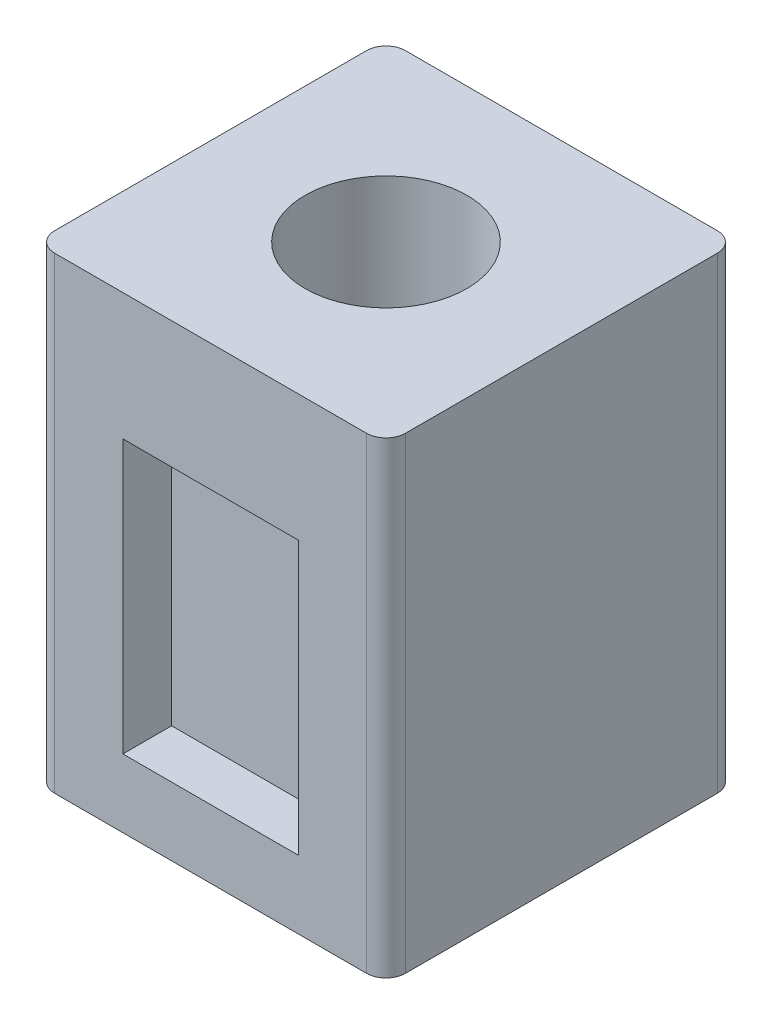
ISO-10303-21;
HEADER;
FILE_DESCRIPTION(('STEP AP214'),'2;1');
FILE_NAME('part.step','',(''),(''),'','','');
FILE_SCHEMA(('AUTOMOTIVE_DESIGN { 1 0 10303 214 1 1 1 1 }'));
ENDSEC;
DATA;
#1=APPLICATION_CONTEXT('core data for automotive mechanical design processes');
#2=APPLICATION_PROTOCOL_DEFINITION('international standard','automotive_design',2000,#1);
#3=PRODUCT_CONTEXT('',#1,'mechanical');
#4=PRODUCT('Part','Part','',(#3));
#5=PRODUCT_RELATED_PRODUCT_CATEGORY('part','',(#4));
#6=PRODUCT_DEFINITION_FORMATION('','',#4);
#7=PRODUCT_DEFINITION_CONTEXT('part definition',#1,'design');
#8=PRODUCT_DEFINITION('design','',#6,#7);
#9=PRODUCT_DEFINITION_SHAPE('','',#8);
#10=(LENGTH_UNIT() NAMED_UNIT(*) SI_UNIT(.MILLI.,.METRE.));
#11=(NAMED_UNIT(*) PLANE_ANGLE_UNIT() SI_UNIT($,.RADIAN.));
#12=(NAMED_UNIT(*) SI_UNIT($,.STERADIAN.) SOLID_ANGLE_UNIT());
#13=UNCERTAINTY_MEASURE_WITH_UNIT(LENGTH_MEASURE(1.E-05),#10,'distance_accuracy_value','');
#14=(GEOMETRIC_REPRESENTATION_CONTEXT(3) GLOBAL_UNCERTAINTY_ASSIGNED_CONTEXT((#13)) GLOBAL_UNIT_ASSIGNED_CONTEXT((#10,
#11,#12)) REPRESENTATION_CONTEXT('',''));
#15=CARTESIAN_POINT('',(0.,0.,0.));
#16=DIRECTION('',(0.,0.,1.));
#17=DIRECTION('',(1.,0.,0.));
#18=AXIS2_PLACEMENT_3D('',#15,#16,#17);
#19=CARTESIAN_POINT('',(0.,48.,36.));
#20=DIRECTION('',(1.,0.,0.));
#21=DIRECTION('',(0.,0.,-1.));
#22=AXIS2_PLACEMENT_3D('',#19,#20,#21);
#23=PLANE('',#22);
#24=DIRECTION('',(0.,0.,-1.));
#25=VECTOR('',#24,1.);
#26=CARTESIAN_POINT('',(0.,48.,36.));
#27=LINE('',#26,#25);
#28=CARTESIAN_POINT('',(0.,48.,34.));
#29=VERTEX_POINT('',#28);
#30=CARTESIAN_POINT('',(0.,48.,2.));
#31=VERTEX_POINT('',#30);
#32=EDGE_CURVE('E179',#29,#31,#27,.T.);
#33=ORIENTED_EDGE('',*,*,#32,.T.);
#34=DIRECTION('',(0.,-1.,0.));
#35=VECTOR('',#34,1.);
#36=CARTESIAN_POINT('',(0.,48.,2.));
#37=LINE('',#36,#35);
#38=CARTESIAN_POINT('',(0.,0.,2.));
#39=VERTEX_POINT('',#38);
#40=EDGE_CURVE('E197',#31,#39,#37,.T.);
#41=ORIENTED_EDGE('',*,*,#40,.T.);
#42=DIRECTION('',(0.,0.,-1.));
#43=VECTOR('',#42,1.);
#44=CARTESIAN_POINT('',(0.,0.,36.));
#45=LINE('',#44,#43);
#46=CARTESIAN_POINT('',(0.,0.,34.));
#47=VERTEX_POINT('',#46);
#48=EDGE_CURVE('E192',#47,#39,#45,.T.);
#49=ORIENTED_EDGE('',*,*,#48,.F.);
#50=DIRECTION('',(0.,-1.,0.));
#51=VECTOR('',#50,1.);
#52=CARTESIAN_POINT('',(0.,48.,34.));
#53=LINE('',#52,#51);
#54=EDGE_CURVE('E195',#47,#29,#53,.F.);
#55=ORIENTED_EDGE('',*,*,#54,.T.);
#56=EDGE_LOOP('',(#33,#41,#49,#55));
#57=FACE_BOUND('',#56,.T.);
#58=ADVANCED_FACE('F39',(#57),#23,.F.);
#59=CARTESIAN_POINT('',(0.,0.,36.));
#60=DIRECTION('',(0.,1.,0.));
#61=DIRECTION('',(0.,0.,1.));
#62=AXIS2_PLACEMENT_3D('',#59,#60,#61);
#63=PLANE('',#62);
#64=CARTESIAN_POINT('',(18.,0.,18.));
#65=DIRECTION('',(0.,1.,0.));
#66=DIRECTION('',(0.,0.,1.));
#67=AXIS2_PLACEMENT_3D('',#64,#65,#66);
#68=CIRCLE('',#67,8.3);
#69=CARTESIAN_POINT('',(18.,0.,26.3));
#70=VERTEX_POINT('',#69);
#71=EDGE_CURVE('E162',#70,#70,#68,.T.);
#72=ORIENTED_EDGE('',*,*,#71,.T.);
#73=EDGE_LOOP('',(#72));
#74=FACE_BOUND('',#73,.T.);
#75=ORIENTED_EDGE('',*,*,#48,.T.);
#76=CARTESIAN_POINT('',(2.,0.,2.));
#77=DIRECTION('',(0.,1.,0.));
#78=DIRECTION('',(0.,0.,1.));
#79=AXIS2_PLACEMENT_3D('',#76,#77,#78);
#80=CIRCLE('',#79,2.);
#81=CARTESIAN_POINT('',(2.,0.,0.));
#82=VERTEX_POINT('',#81);
#83=EDGE_CURVE('E206',#39,#82,#80,.F.);
#84=ORIENTED_EDGE('',*,*,#83,.T.);
#85=DIRECTION('',(1.,0.,0.));
#86=VECTOR('',#85,1.);
#87=CARTESIAN_POINT('',(0.,0.,0.));
#88=LINE('',#87,#86);
#89=CARTESIAN_POINT('',(34.,0.,0.));
#90=VERTEX_POINT('',#89);
#91=EDGE_CURVE('E168',#82,#90,#88,.T.);
#92=ORIENTED_EDGE('',*,*,#91,.T.);
#93=CARTESIAN_POINT('',(34.,0.,2.));
#94=DIRECTION('',(0.,1.,0.));
#95=DIRECTION('',(0.,0.,1.));
#96=AXIS2_PLACEMENT_3D('',#93,#94,#95);
#97=CIRCLE('',#96,2.);
#98=CARTESIAN_POINT('',(36.,0.,2.));
#99=VERTEX_POINT('',#98);
#100=EDGE_CURVE('E204',#90,#99,#97,.F.);
#101=ORIENTED_EDGE('',*,*,#100,.T.);
#102=DIRECTION('',(0.,0.,-1.));
#103=VECTOR('',#102,1.);
#104=CARTESIAN_POINT('',(36.,0.,36.));
#105=LINE('',#104,#103);
#106=CARTESIAN_POINT('',(36.,0.,34.));
#107=VERTEX_POINT('',#106);
#108=EDGE_CURVE('E189',#107,#99,#105,.T.);
#109=ORIENTED_EDGE('',*,*,#108,.F.);
#110=CARTESIAN_POINT('',(34.,0.,34.));
#111=DIRECTION('',(0.,1.,0.));
#112=DIRECTION('',(0.,0.,1.));
#113=AXIS2_PLACEMENT_3D('',#110,#111,#112);
#114=CIRCLE('',#113,2.);
#115=CARTESIAN_POINT('',(34.,0.,36.));
#116=VERTEX_POINT('',#115);
#117=EDGE_CURVE('E200',#107,#116,#114,.F.);
#118=ORIENTED_EDGE('',*,*,#117,.T.);
#119=DIRECTION('',(1.,0.,0.));
#120=VECTOR('',#119,1.);
#121=CARTESIAN_POINT('',(0.,0.,36.));
#122=LINE('',#121,#120);
#123=CARTESIAN_POINT('',(2.,0.,36.));
#124=VERTEX_POINT('',#123);
#125=EDGE_CURVE('E172',#124,#116,#122,.T.);
#126=ORIENTED_EDGE('',*,*,#125,.F.);
#127=CARTESIAN_POINT('',(2.,0.,34.));
#128=DIRECTION('',(0.,1.,0.));
#129=DIRECTION('',(0.,0.,1.));
#130=AXIS2_PLACEMENT_3D('',#127,#128,#129);
#131=CIRCLE('',#130,2.);
#132=EDGE_CURVE('E202',#124,#47,#131,.F.);
#133=ORIENTED_EDGE('',*,*,#132,.T.);
#134=EDGE_LOOP('',(#75,#84,#92,#101,#109,#118,#126,#133));
#135=FACE_BOUND('',#134,.T.);
#136=ADVANCED_FACE('F240',(#74,#135),#63,.F.);
#137=CARTESIAN_POINT('',(36.,0.,36.));
#138=DIRECTION('',(-1.,0.,0.));
#139=DIRECTION('',(0.,0.,1.));
#140=AXIS2_PLACEMENT_3D('',#137,#138,#139);
#141=PLANE('',#140);
#142=ORIENTED_EDGE('',*,*,#108,.T.);
#143=DIRECTION('',(0.,1.,0.));
#144=VECTOR('',#143,1.);
#145=CARTESIAN_POINT('',(36.,0.,2.));
#146=LINE('',#145,#144);
#147=CARTESIAN_POINT('',(36.,48.,2.));
#148=VERTEX_POINT('',#147);
#149=EDGE_CURVE('E221',#99,#148,#146,.T.);
#150=ORIENTED_EDGE('',*,*,#149,.T.);
#151=DIRECTION('',(0.,0.,-1.));
#152=VECTOR('',#151,1.);
#153=CARTESIAN_POINT('',(36.,48.,36.));
#154=LINE('',#153,#152);
#155=CARTESIAN_POINT('',(36.,48.,34.));
#156=VERTEX_POINT('',#155);
#157=EDGE_CURVE('E186',#156,#148,#154,.T.);
#158=ORIENTED_EDGE('',*,*,#157,.F.);
#159=DIRECTION('',(0.,1.,0.));
#160=VECTOR('',#159,1.);
#161=CARTESIAN_POINT('',(36.,0.,34.));
#162=LINE('',#161,#160);
#163=EDGE_CURVE('E219',#156,#107,#162,.F.);
#164=ORIENTED_EDGE('',*,*,#163,.T.);
#165=EDGE_LOOP('',(#142,#150,#158,#164));
#166=FACE_BOUND('',#165,.T.);
#167=ADVANCED_FACE('F245',(#166),#141,.F.);
#168=CARTESIAN_POINT('',(36.,48.,36.));
#169=DIRECTION('',(0.,-1.,0.));
#170=DIRECTION('',(0.,0.,-1.));
#171=AXIS2_PLACEMENT_3D('',#168,#169,#170);
#172=PLANE('',#171);
#173=CARTESIAN_POINT('',(18.,48.,18.));
#174=DIRECTION('',(0.,1.,0.));
#175=DIRECTION('',(0.,0.,1.));
#176=AXIS2_PLACEMENT_3D('',#173,#174,#175);
#177=CIRCLE('',#176,8.3);
#178=CARTESIAN_POINT('',(18.,48.,26.3));
#179=VERTEX_POINT('',#178);
#180=EDGE_CURVE('E155',#179,#179,#177,.T.);
#181=ORIENTED_EDGE('',*,*,#180,.F.);
#182=EDGE_LOOP('',(#181));
#183=FACE_BOUND('',#182,.T.);
#184=DIRECTION('',(-1.,0.,0.));
#185=VECTOR('',#184,1.);
#186=CARTESIAN_POINT('',(36.,48.,0.));
#187=LINE('',#186,#185);
#188=CARTESIAN_POINT('',(34.,48.,0.));
#189=VERTEX_POINT('',#188);
#190=CARTESIAN_POINT('',(2.,48.,0.));
#191=VERTEX_POINT('',#190);
#192=EDGE_CURVE('E176',#189,#191,#187,.T.);
#193=ORIENTED_EDGE('',*,*,#192,.T.);
#194=CARTESIAN_POINT('',(2.,48.,2.));
#195=DIRECTION('',(0.,-1.,0.));
#196=DIRECTION('',(0.,0.,-1.));
#197=AXIS2_PLACEMENT_3D('',#194,#195,#196);
#198=CIRCLE('',#197,2.);
#199=EDGE_CURVE('E217',#191,#31,#198,.F.);
#200=ORIENTED_EDGE('',*,*,#199,.T.);
#201=ORIENTED_EDGE('',*,*,#32,.F.);
#202=CARTESIAN_POINT('',(2.,48.,34.));
#203=DIRECTION('',(0.,-1.,0.));
#204=DIRECTION('',(0.,0.,-1.));
#205=AXIS2_PLACEMENT_3D('',#202,#203,#204);
#206=CIRCLE('',#205,2.);
#207=CARTESIAN_POINT('',(2.,48.,36.));
#208=VERTEX_POINT('',#207);
#209=EDGE_CURVE('E214',#29,#208,#206,.F.);
#210=ORIENTED_EDGE('',*,*,#209,.T.);
#211=DIRECTION('',(-1.,0.,0.));
#212=VECTOR('',#211,1.);
#213=CARTESIAN_POINT('',(36.,48.,36.));
#214=LINE('',#213,#212);
#215=CARTESIAN_POINT('',(34.,48.,36.));
#216=VERTEX_POINT('',#215);
#217=EDGE_CURVE('E175',#216,#208,#214,.T.);
#218=ORIENTED_EDGE('',*,*,#217,.F.);
#219=CARTESIAN_POINT('',(34.,48.,34.));
#220=DIRECTION('',(0.,-1.,0.));
#221=DIRECTION('',(0.,0.,-1.));
#222=AXIS2_PLACEMENT_3D('',#219,#220,#221);
#223=CIRCLE('',#222,2.);
#224=EDGE_CURVE('E212',#216,#156,#223,.F.);
#225=ORIENTED_EDGE('',*,*,#224,.T.);
#226=ORIENTED_EDGE('',*,*,#157,.T.);
#227=CARTESIAN_POINT('',(34.,48.,2.));
#228=DIRECTION('',(0.,-1.,0.));
#229=DIRECTION('',(0.,0.,-1.));
#230=AXIS2_PLACEMENT_3D('',#227,#228,#229);
#231=CIRCLE('',#230,2.);
#232=EDGE_CURVE('E62',#148,#189,#231,.F.);
#233=ORIENTED_EDGE('',*,*,#232,.T.);
#234=EDGE_LOOP('',(#193,#200,#201,#210,#218,#225,#226,#233));
#235=FACE_BOUND('',#234,.T.);
#236=ADVANCED_FACE('F232',(#183,#235),#172,.F.);
#237=CARTESIAN_POINT('',(0.,0.,36.));
#238=DIRECTION('',(0.,0.,1.));
#239=DIRECTION('',(1.,0.,0.));
#240=AXIS2_PLACEMENT_3D('',#237,#238,#239);
#241=PLANE('',#240);
#242=DIRECTION('',(0.,-1.,0.));
#243=VECTOR('',#242,1.);
#244=CARTESIAN_POINT('',(9.,35.,36.));
#245=LINE('',#244,#243);
#246=CARTESIAN_POINT('',(9.,35.,36.));
#247=VERTEX_POINT('',#246);
#248=CARTESIAN_POINT('',(9.,7.,36.));
#249=VERTEX_POINT('',#248);
#250=EDGE_CURVE('E54',#247,#249,#245,.T.);
#251=ORIENTED_EDGE('',*,*,#250,.F.);
#252=DIRECTION('',(-1.,0.,0.));
#253=VECTOR('',#252,1.);
#254=CARTESIAN_POINT('',(27.,35.,36.));
#255=LINE('',#254,#253);
#256=CARTESIAN_POINT('',(27.,35.,36.));
#257=VERTEX_POINT('',#256);
#258=EDGE_CURVE('E149',#257,#247,#255,.T.);
#259=ORIENTED_EDGE('',*,*,#258,.F.);
#260=DIRECTION('',(0.,1.,0.));
#261=VECTOR('',#260,1.);
#262=CARTESIAN_POINT('',(27.,7.,36.));
#263=LINE('',#262,#261);
#264=CARTESIAN_POINT('',(27.,7.,36.));
#265=VERTEX_POINT('',#264);
#266=EDGE_CURVE('E152',#265,#257,#263,.T.);
#267=ORIENTED_EDGE('',*,*,#266,.F.);
#268=DIRECTION('',(1.,0.,0.));
#269=VECTOR('',#268,1.);
#270=CARTESIAN_POINT('',(9.,7.,36.));
#271=LINE('',#270,#269);
#272=EDGE_CURVE('E161',#249,#265,#271,.T.);
#273=ORIENTED_EDGE('',*,*,#272,.F.);
#274=EDGE_LOOP('',(#251,#259,#267,#273));
#275=FACE_BOUND('',#274,.T.);
#276=ORIENTED_EDGE('',*,*,#217,.T.);
#277=DIRECTION('',(0.,-1.,0.));
#278=VECTOR('',#277,1.);
#279=CARTESIAN_POINT('',(2.,0.,36.));
#280=LINE('',#279,#278);
#281=EDGE_CURVE('E11',#208,#124,#280,.T.);
#282=ORIENTED_EDGE('',*,*,#281,.T.);
#283=ORIENTED_EDGE('',*,*,#125,.T.);
#284=DIRECTION('',(0.,1.,0.));
#285=VECTOR('',#284,1.);
#286=CARTESIAN_POINT('',(34.,48.,36.));
#287=LINE('',#286,#285);
#288=EDGE_CURVE('E47',#116,#216,#287,.T.);
#289=ORIENTED_EDGE('',*,*,#288,.T.);
#290=EDGE_LOOP('',(#276,#282,#283,#289));
#291=FACE_BOUND('',#290,.T.);
#292=ADVANCED_FACE('F226',(#275,#291),#241,.T.);
#293=CARTESIAN_POINT('',(0.,0.,0.));
#294=DIRECTION('',(0.,0.,1.));
#295=DIRECTION('',(1.,0.,0.));
#296=AXIS2_PLACEMENT_3D('',#293,#294,#295);
#297=PLANE('',#296);
#298=ORIENTED_EDGE('',*,*,#91,.F.);
#299=DIRECTION('',(0.,-1.,0.));
#300=VECTOR('',#299,1.);
#301=CARTESIAN_POINT('',(2.,0.,0.));
#302=LINE('',#301,#300);
#303=EDGE_CURVE('E210',#82,#191,#302,.F.);
#304=ORIENTED_EDGE('',*,*,#303,.T.);
#305=ORIENTED_EDGE('',*,*,#192,.F.);
#306=DIRECTION('',(0.,1.,0.));
#307=VECTOR('',#306,1.);
#308=CARTESIAN_POINT('',(34.,0.,0.));
#309=LINE('',#308,#307);
#310=EDGE_CURVE('E208',#189,#90,#309,.F.);
#311=ORIENTED_EDGE('',*,*,#310,.T.);
#312=EDGE_LOOP('',(#298,#304,#305,#311));
#313=FACE_BOUND('',#312,.T.);
#314=ADVANCED_FACE('F250',(#313),#297,.F.);
#315=CARTESIAN_POINT('',(2.,48.,2.));
#316=DIRECTION('',(0.,-1.,0.));
#317=DIRECTION('',(0.,0.,-1.));
#318=AXIS2_PLACEMENT_3D('',#315,#316,#317);
#319=CYLINDRICAL_SURFACE('',#318,2.);
#320=ORIENTED_EDGE('',*,*,#199,.F.);
#321=ORIENTED_EDGE('',*,*,#303,.F.);
#322=ORIENTED_EDGE('',*,*,#83,.F.);
#323=ORIENTED_EDGE('',*,*,#40,.F.);
#324=EDGE_LOOP('',(#320,#321,#322,#323));
#325=FACE_BOUND('',#324,.T.);
#326=ADVANCED_FACE('F255',(#325),#319,.T.);
#327=CARTESIAN_POINT('',(34.,0.,2.));
#328=DIRECTION('',(0.,1.,0.));
#329=DIRECTION('',(0.,0.,1.));
#330=AXIS2_PLACEMENT_3D('',#327,#328,#329);
#331=CYLINDRICAL_SURFACE('',#330,2.);
#332=ORIENTED_EDGE('',*,*,#100,.F.);
#333=ORIENTED_EDGE('',*,*,#310,.F.);
#334=ORIENTED_EDGE('',*,*,#232,.F.);
#335=ORIENTED_EDGE('',*,*,#149,.F.);
#336=EDGE_LOOP('',(#332,#333,#334,#335));
#337=FACE_BOUND('',#336,.T.);
#338=ADVANCED_FACE('F253',(#337),#331,.T.);
#339=CARTESIAN_POINT('',(2.,0.,34.));
#340=DIRECTION('',(0.,1.,0.));
#341=DIRECTION('',(0.,0.,1.));
#342=AXIS2_PLACEMENT_3D('',#339,#340,#341);
#343=CYLINDRICAL_SURFACE('',#342,2.);
#344=ORIENTED_EDGE('',*,*,#209,.F.);
#345=ORIENTED_EDGE('',*,*,#54,.F.);
#346=ORIENTED_EDGE('',*,*,#132,.F.);
#347=ORIENTED_EDGE('',*,*,#281,.F.);
#348=EDGE_LOOP('',(#344,#345,#346,#347));
#349=FACE_BOUND('',#348,.T.);
#350=ADVANCED_FACE('F238',(#349),#343,.T.);
#351=CARTESIAN_POINT('',(34.,0.,34.));
#352=DIRECTION('',(0.,-1.,0.));
#353=DIRECTION('',(0.,0.,-1.));
#354=AXIS2_PLACEMENT_3D('',#351,#352,#353);
#355=CYLINDRICAL_SURFACE('',#354,2.);
#356=ORIENTED_EDGE('',*,*,#117,.F.);
#357=ORIENTED_EDGE('',*,*,#163,.F.);
#358=ORIENTED_EDGE('',*,*,#224,.F.);
#359=ORIENTED_EDGE('',*,*,#288,.F.);
#360=EDGE_LOOP('',(#356,#357,#358,#359));
#361=FACE_BOUND('',#360,.T.);
#362=ADVANCED_FACE('F41',(#361),#355,.T.);
#363=CARTESIAN_POINT('',(9.,35.,31.));
#364=DIRECTION('',(-1.,0.,0.));
#365=DIRECTION('',(0.,0.,1.));
#366=AXIS2_PLACEMENT_3D('',#363,#364,#365);
#367=PLANE('',#366);
#368=ORIENTED_EDGE('',*,*,#250,.T.);
#369=DIRECTION('',(0.,0.,1.));
#370=VECTOR('',#369,1.);
#371=CARTESIAN_POINT('',(9.,7.,31.));
#372=LINE('',#371,#370);
#373=CARTESIAN_POINT('',(9.,7.,31.));
#374=VERTEX_POINT('',#373);
#375=EDGE_CURVE('E127',#374,#249,#372,.T.);
#376=ORIENTED_EDGE('',*,*,#375,.F.);
#377=DIRECTION('',(0.,-1.,0.));
#378=VECTOR('',#377,1.);
#379=CARTESIAN_POINT('',(9.,35.,31.));
#380=LINE('',#379,#378);
#381=CARTESIAN_POINT('',(9.,35.,31.));
#382=VERTEX_POINT('',#381);
#383=EDGE_CURVE('E131',#382,#374,#380,.T.);
#384=ORIENTED_EDGE('',*,*,#383,.F.);
#385=DIRECTION('',(0.,0.,1.));
#386=VECTOR('',#385,1.);
#387=CARTESIAN_POINT('',(9.,35.,31.));
#388=LINE('',#387,#386);
#389=EDGE_CURVE('E166',#382,#247,#388,.T.);
#390=ORIENTED_EDGE('',*,*,#389,.T.);
#391=EDGE_LOOP('',(#368,#376,#384,#390));
#392=FACE_BOUND('',#391,.T.);
#393=ADVANCED_FACE('F129',(#392),#367,.F.);
#394=CARTESIAN_POINT('',(27.,35.,31.));
#395=DIRECTION('',(0.,1.,0.));
#396=DIRECTION('',(0.,0.,1.));
#397=AXIS2_PLACEMENT_3D('',#394,#395,#396);
#398=PLANE('',#397);
#399=ORIENTED_EDGE('',*,*,#258,.T.);
#400=ORIENTED_EDGE('',*,*,#389,.F.);
#401=DIRECTION('',(-1.,0.,0.));
#402=VECTOR('',#401,1.);
#403=CARTESIAN_POINT('',(27.,35.,31.));
#404=LINE('',#403,#402);
#405=CARTESIAN_POINT('',(27.,35.,31.));
#406=VERTEX_POINT('',#405);
#407=EDGE_CURVE('E137',#406,#382,#404,.T.);
#408=ORIENTED_EDGE('',*,*,#407,.F.);
#409=DIRECTION('',(0.,0.,1.));
#410=VECTOR('',#409,1.);
#411=CARTESIAN_POINT('',(27.,35.,31.));
#412=LINE('',#411,#410);
#413=EDGE_CURVE('E169',#406,#257,#412,.T.);
#414=ORIENTED_EDGE('',*,*,#413,.T.);
#415=EDGE_LOOP('',(#399,#400,#408,#414));
#416=FACE_BOUND('',#415,.T.);
#417=ADVANCED_FACE('F277',(#416),#398,.F.);
#418=CARTESIAN_POINT('',(27.,7.,31.));
#419=DIRECTION('',(1.,0.,0.));
#420=DIRECTION('',(0.,0.,-1.));
#421=AXIS2_PLACEMENT_3D('',#418,#419,#420);
#422=PLANE('',#421);
#423=ORIENTED_EDGE('',*,*,#266,.T.);
#424=ORIENTED_EDGE('',*,*,#413,.F.);
#425=DIRECTION('',(0.,1.,0.));
#426=VECTOR('',#425,1.);
#427=CARTESIAN_POINT('',(27.,7.,31.));
#428=LINE('',#427,#426);
#429=CARTESIAN_POINT('',(27.,7.,31.));
#430=VERTEX_POINT('',#429);
#431=EDGE_CURVE('E145',#430,#406,#428,.T.);
#432=ORIENTED_EDGE('',*,*,#431,.F.);
#433=DIRECTION('',(0.,0.,1.));
#434=VECTOR('',#433,1.);
#435=CARTESIAN_POINT('',(27.,7.,31.));
#436=LINE('',#435,#434);
#437=EDGE_CURVE('E136',#430,#265,#436,.T.);
#438=ORIENTED_EDGE('',*,*,#437,.T.);
#439=EDGE_LOOP('',(#423,#424,#432,#438));
#440=FACE_BOUND('',#439,.T.);
#441=ADVANCED_FACE('F282',(#440),#422,.F.);
#442=CARTESIAN_POINT('',(9.,7.,31.));
#443=DIRECTION('',(0.,-1.,0.));
#444=DIRECTION('',(0.,0.,-1.));
#445=AXIS2_PLACEMENT_3D('',#442,#443,#444);
#446=PLANE('',#445);
#447=ORIENTED_EDGE('',*,*,#272,.T.);
#448=ORIENTED_EDGE('',*,*,#437,.F.);
#449=DIRECTION('',(1.,0.,0.));
#450=VECTOR('',#449,1.);
#451=CARTESIAN_POINT('',(9.,7.,31.));
#452=LINE('',#451,#450);
#453=EDGE_CURVE('E140',#374,#430,#452,.T.);
#454=ORIENTED_EDGE('',*,*,#453,.F.);
#455=ORIENTED_EDGE('',*,*,#375,.T.);
#456=EDGE_LOOP('',(#447,#448,#454,#455));
#457=FACE_BOUND('',#456,.T.);
#458=ADVANCED_FACE('F141',(#457),#446,.F.);
#459=CARTESIAN_POINT('',(0.,0.,31.));
#460=DIRECTION('',(0.,0.,1.));
#461=DIRECTION('',(1.,0.,0.));
#462=AXIS2_PLACEMENT_3D('',#459,#460,#461);
#463=PLANE('',#462);
#464=ORIENTED_EDGE('',*,*,#383,.T.);
#465=ORIENTED_EDGE('',*,*,#453,.T.);
#466=ORIENTED_EDGE('',*,*,#431,.T.);
#467=ORIENTED_EDGE('',*,*,#407,.T.);
#468=EDGE_LOOP('',(#464,#465,#466,#467));
#469=FACE_BOUND('',#468,.T.);
#470=ADVANCED_FACE('F147',(#469),#463,.T.);
#471=CARTESIAN_POINT('',(18.,0.,18.));
#472=DIRECTION('',(0.,1.,0.));
#473=DIRECTION('',(0.,0.,1.));
#474=AXIS2_PLACEMENT_3D('',#471,#472,#473);
#475=CYLINDRICAL_SURFACE('',#474,8.3);
#476=ORIENTED_EDGE('',*,*,#71,.F.);
#477=EDGE_LOOP('',(#476));
#478=FACE_BOUND('',#477,.T.);
#479=ORIENTED_EDGE('',*,*,#180,.T.);
#480=EDGE_LOOP('',(#479));
#481=FACE_BOUND('',#480,.T.);
#482=ADVANCED_FACE('F374',(#478,#481),#475,.F.);
#483=CLOSED_SHELL('',(#58,#136,#167,#236,#292,#314,#326,#338,#350,#362,#393,#417,#441,#458,#470,#482));
#484=MANIFOLD_SOLID_BREP('B2',#483);
#485=ADVANCED_BREP_SHAPE_REPRESENTATION('',(#18,#484),#14);
#486=SHAPE_DEFINITION_REPRESENTATION(#9,#485);
ENDSEC;
END-ISO-10303-21;
